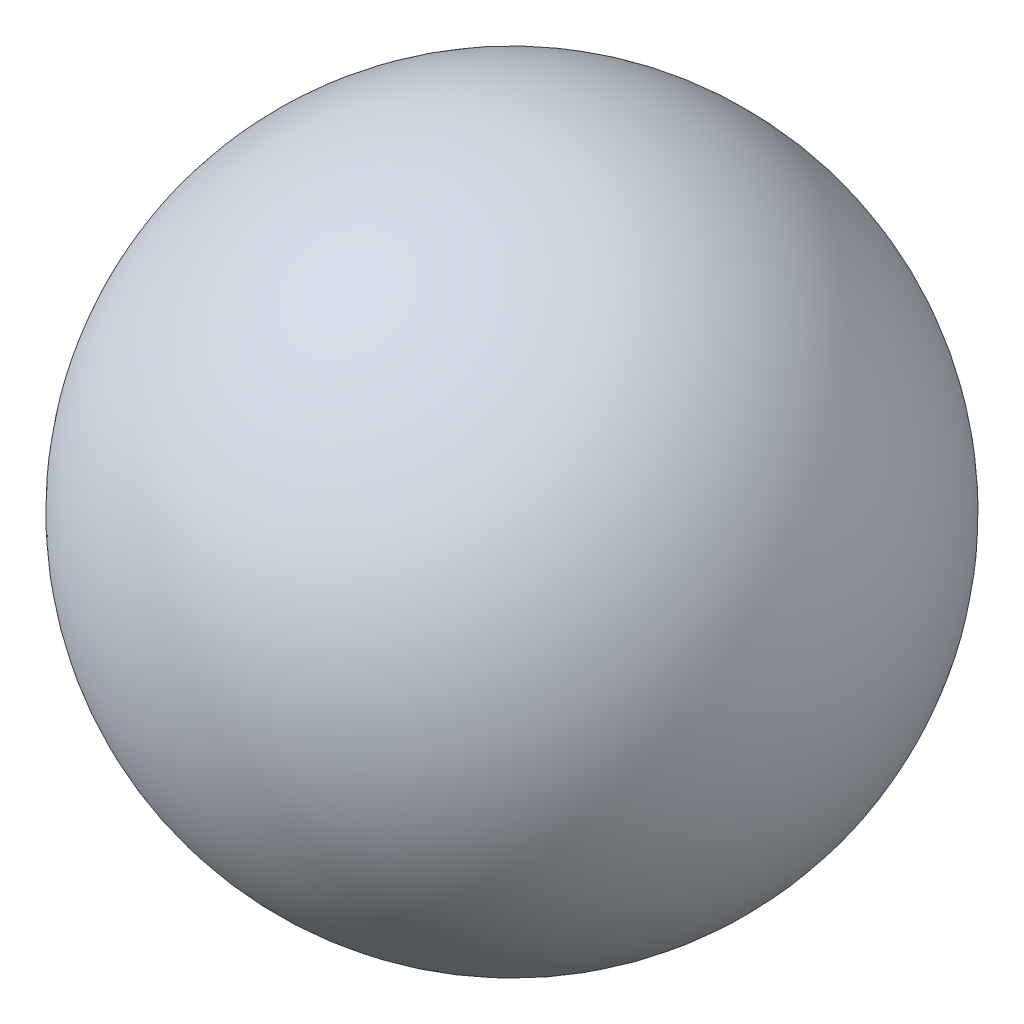
ISO-10303-21;
HEADER;
FILE_DESCRIPTION(('STEP AP214'),'2;1');
FILE_NAME('part.step','',(''),(''),'','','');
FILE_SCHEMA(('AUTOMOTIVE_DESIGN { 1 0 10303 214 1 1 1 1 }'));
ENDSEC;
DATA;
#1=APPLICATION_CONTEXT('core data for automotive mechanical design processes');
#2=APPLICATION_PROTOCOL_DEFINITION('international standard','automotive_design',2000,#1);
#3=PRODUCT_CONTEXT('',#1,'mechanical');
#4=PRODUCT('Part','Part','',(#3));
#5=PRODUCT_RELATED_PRODUCT_CATEGORY('part','',(#4));
#6=PRODUCT_DEFINITION_FORMATION('','',#4);
#7=PRODUCT_DEFINITION_CONTEXT('part definition',#1,'design');
#8=PRODUCT_DEFINITION('design','',#6,#7);
#9=PRODUCT_DEFINITION_SHAPE('','',#8);
#10=(LENGTH_UNIT() NAMED_UNIT(*) SI_UNIT(.MILLI.,.METRE.));
#11=(NAMED_UNIT(*) PLANE_ANGLE_UNIT() SI_UNIT($,.RADIAN.));
#12=(NAMED_UNIT(*) SI_UNIT($,.STERADIAN.) SOLID_ANGLE_UNIT());
#13=UNCERTAINTY_MEASURE_WITH_UNIT(LENGTH_MEASURE(1.E-05),#10,'distance_accuracy_value','');
#14=(GEOMETRIC_REPRESENTATION_CONTEXT(3) GLOBAL_UNCERTAINTY_ASSIGNED_CONTEXT((#13)) GLOBAL_UNIT_ASSIGNED_CONTEXT((#10,
#11,#12)) REPRESENTATION_CONTEXT('',''));
#15=CARTESIAN_POINT('',(0.,0.,0.));
#16=DIRECTION('',(0.,0.,1.));
#17=DIRECTION('',(1.,0.,0.));
#18=AXIS2_PLACEMENT_3D('',#15,#16,#17);
#19=CARTESIAN_POINT('',(13.9,66.275,0.));
#20=DIRECTION('',(-1.,0.,0.));
#21=DIRECTION('',(0.,1.,0.));
#22=AXIS2_PLACEMENT_3D('',#19,#20,#21);
#23=SPHERICAL_SURFACE('',#22,11.906);
#24=CARTESIAN_POINT('',(1.994,66.275,0.));
#25=VERTEX_POINT('',#24);
#26=VERTEX_LOOP('',#25);
#27=FACE_BOUND('',#26,.T.);
#28=ADVANCED_FACE('F29',(#27),#23,.T.);
#29=CLOSED_SHELL('',(#28));
#30=MANIFOLD_SOLID_BREP('B2',#29);
#31=ADVANCED_BREP_SHAPE_REPRESENTATION('',(#18,#30),#14);
#32=SHAPE_DEFINITION_REPRESENTATION(#9,#31);
ENDSEC;
END-ISO-10303-21;
